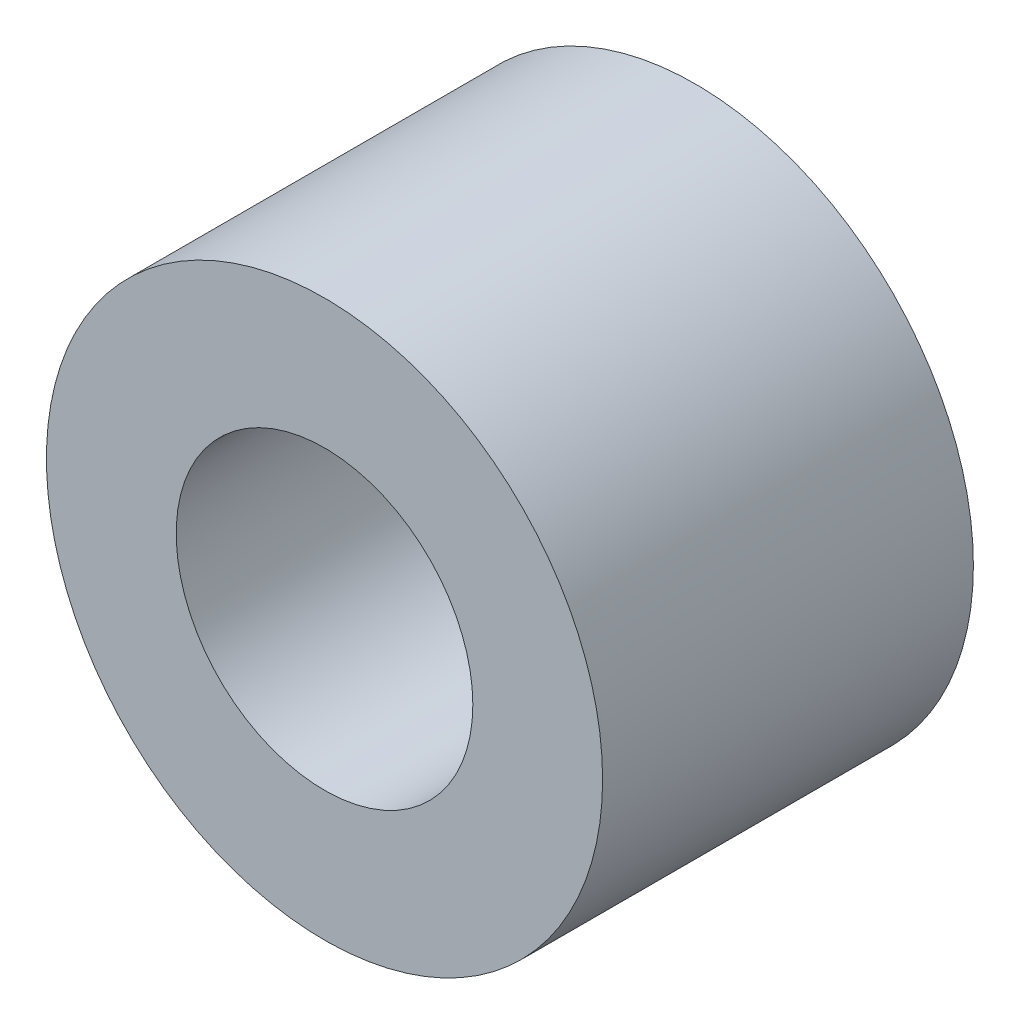
ISO-10303-21;
HEADER;
FILE_DESCRIPTION(('STEP AP214'),'2;1');
FILE_NAME('part.step','',(''),(''),'','','');
FILE_SCHEMA(('AUTOMOTIVE_DESIGN { 1 0 10303 214 1 1 1 1 }'));
ENDSEC;
DATA;
#1=APPLICATION_CONTEXT('core data for automotive mechanical design processes');
#2=APPLICATION_PROTOCOL_DEFINITION('international standard','automotive_design',2000,#1);
#3=PRODUCT_CONTEXT('',#1,'mechanical');
#4=PRODUCT('Part','Part','',(#3));
#5=PRODUCT_RELATED_PRODUCT_CATEGORY('part','',(#4));
#6=PRODUCT_DEFINITION_FORMATION('','',#4);
#7=PRODUCT_DEFINITION_CONTEXT('part definition',#1,'design');
#8=PRODUCT_DEFINITION('design','',#6,#7);
#9=PRODUCT_DEFINITION_SHAPE('','',#8);
#10=(LENGTH_UNIT() NAMED_UNIT(*) SI_UNIT(.MILLI.,.METRE.));
#11=(NAMED_UNIT(*) PLANE_ANGLE_UNIT() SI_UNIT($,.RADIAN.));
#12=(NAMED_UNIT(*) SI_UNIT($,.STERADIAN.) SOLID_ANGLE_UNIT());
#13=UNCERTAINTY_MEASURE_WITH_UNIT(LENGTH_MEASURE(1.E-05),#10,'distance_accuracy_value','');
#14=(GEOMETRIC_REPRESENTATION_CONTEXT(3) GLOBAL_UNCERTAINTY_ASSIGNED_CONTEXT((#13)) GLOBAL_UNIT_ASSIGNED_CONTEXT((#10,
#11,#12)) REPRESENTATION_CONTEXT('',''));
#15=CARTESIAN_POINT('',(0.,0.,0.));
#16=DIRECTION('',(0.,0.,1.));
#17=DIRECTION('',(1.,0.,0.));
#18=AXIS2_PLACEMENT_3D('',#15,#16,#17);
#19=CARTESIAN_POINT('',(0.,0.,4.));
#20=DIRECTION('',(0.,0.,1.));
#21=DIRECTION('',(1.,0.,0.));
#22=AXIS2_PLACEMENT_3D('',#19,#20,#21);
#23=PLANE('',#22);
#24=CARTESIAN_POINT('',(0.,0.,4.));
#25=DIRECTION('',(0.,0.,1.));
#26=DIRECTION('',(1.,0.,0.));
#27=AXIS2_PLACEMENT_3D('',#24,#25,#26);
#28=CIRCLE('',#27,3.);
#29=CARTESIAN_POINT('',(3.,0.,4.));
#30=VERTEX_POINT('',#29);
#31=EDGE_CURVE('E10',#30,#30,#28,.T.);
#32=ORIENTED_EDGE('',*,*,#31,.T.);
#33=EDGE_LOOP('',(#32));
#34=FACE_BOUND('',#33,.T.);
#35=CARTESIAN_POINT('',(0.,0.,4.));
#36=DIRECTION('',(0.,0.,1.));
#37=DIRECTION('',(1.,0.,0.));
#38=AXIS2_PLACEMENT_3D('',#35,#36,#37);
#39=CIRCLE('',#38,1.6);
#40=CARTESIAN_POINT('',(1.6,0.,4.));
#41=VERTEX_POINT('',#40);
#42=EDGE_CURVE('E44',#41,#41,#39,.T.);
#43=ORIENTED_EDGE('',*,*,#42,.F.);
#44=EDGE_LOOP('',(#43));
#45=FACE_BOUND('',#44,.T.);
#46=ADVANCED_FACE('F33',(#34,#45),#23,.T.);
#47=CARTESIAN_POINT('',(0.,0.,0.));
#48=DIRECTION('',(0.,0.,1.));
#49=DIRECTION('',(1.,0.,0.));
#50=AXIS2_PLACEMENT_3D('',#47,#48,#49);
#51=PLANE('',#50);
#52=CARTESIAN_POINT('',(0.,0.,0.));
#53=DIRECTION('',(0.,0.,1.));
#54=DIRECTION('',(1.,0.,0.));
#55=AXIS2_PLACEMENT_3D('',#52,#53,#54);
#56=CIRCLE('',#55,3.);
#57=CARTESIAN_POINT('',(3.,0.,0.));
#58=VERTEX_POINT('',#57);
#59=EDGE_CURVE('E37',#58,#58,#56,.T.);
#60=ORIENTED_EDGE('',*,*,#59,.F.);
#61=EDGE_LOOP('',(#60));
#62=FACE_BOUND('',#61,.T.);
#63=CARTESIAN_POINT('',(0.,0.,0.));
#64=DIRECTION('',(0.,0.,1.));
#65=DIRECTION('',(1.,0.,0.));
#66=AXIS2_PLACEMENT_3D('',#63,#64,#65);
#67=CIRCLE('',#66,1.6);
#68=CARTESIAN_POINT('',(1.6,0.,0.));
#69=VERTEX_POINT('',#68);
#70=EDGE_CURVE('E46',#69,#69,#67,.T.);
#71=ORIENTED_EDGE('',*,*,#70,.T.);
#72=EDGE_LOOP('',(#71));
#73=FACE_BOUND('',#72,.T.);
#74=ADVANCED_FACE('F56',(#62,#73),#51,.F.);
#75=CARTESIAN_POINT('',(0.,0.,4.));
#76=DIRECTION('',(0.,0.,-1.));
#77=DIRECTION('',(-1.,0.,0.));
#78=AXIS2_PLACEMENT_3D('',#75,#76,#77);
#79=CYLINDRICAL_SURFACE('',#78,3.);
#80=ORIENTED_EDGE('',*,*,#31,.F.);
#81=EDGE_LOOP('',(#80));
#82=FACE_BOUND('',#81,.T.);
#83=ORIENTED_EDGE('',*,*,#59,.T.);
#84=EDGE_LOOP('',(#83));
#85=FACE_BOUND('',#84,.T.);
#86=ADVANCED_FACE('F35',(#82,#85),#79,.T.);
#87=CARTESIAN_POINT('',(0.,0.,4.));
#88=DIRECTION('',(0.,0.,-1.));
#89=DIRECTION('',(-1.,0.,0.));
#90=AXIS2_PLACEMENT_3D('',#87,#88,#89);
#91=CYLINDRICAL_SURFACE('',#90,1.6);
#92=ORIENTED_EDGE('',*,*,#42,.T.);
#93=EDGE_LOOP('',(#92));
#94=FACE_BOUND('',#93,.T.);
#95=ORIENTED_EDGE('',*,*,#70,.F.);
#96=EDGE_LOOP('',(#95));
#97=FACE_BOUND('',#96,.T.);
#98=ADVANCED_FACE('F52',(#94,#97),#91,.F.);
#99=CLOSED_SHELL('',(#46,#74,#86,#98));
#100=MANIFOLD_SOLID_BREP('B2',#99);
#101=ADVANCED_BREP_SHAPE_REPRESENTATION('',(#18,#100),#14);
#102=SHAPE_DEFINITION_REPRESENTATION(#9,#101);
ENDSEC;
END-ISO-10303-21;
